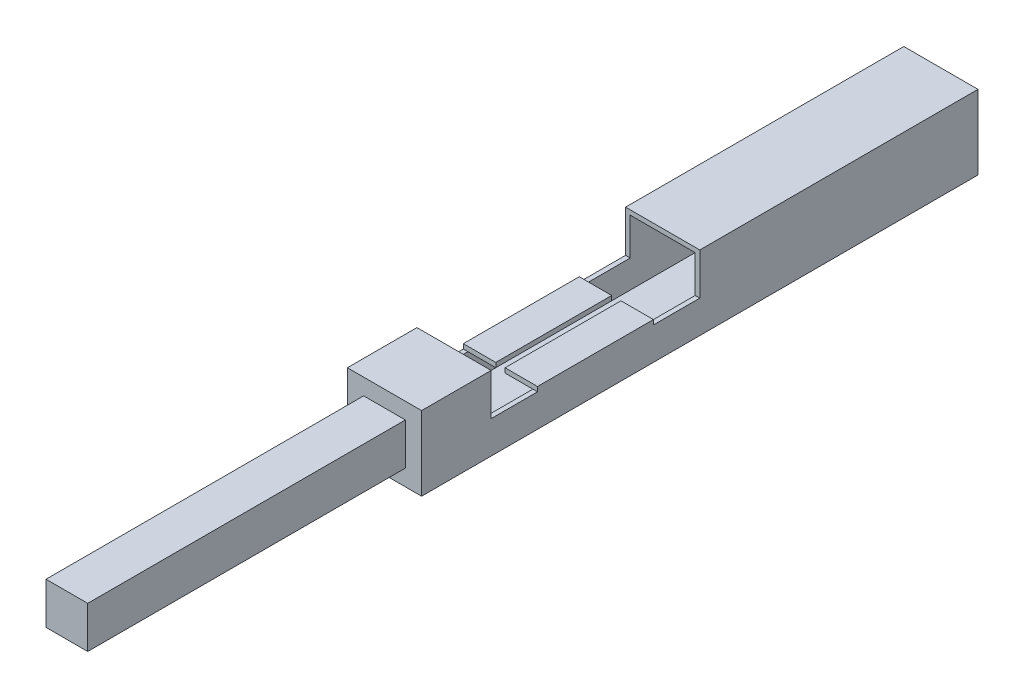
ISO-10303-21;
HEADER;
FILE_DESCRIPTION(('STEP AP214'),'2;1');
FILE_NAME('part.step','',(''),(''),'','','');
FILE_SCHEMA(('AUTOMOTIVE_DESIGN { 1 0 10303 214 1 1 1 1 }'));
ENDSEC;
DATA;
#1=APPLICATION_CONTEXT('core data for automotive mechanical design processes');
#2=APPLICATION_PROTOCOL_DEFINITION('international standard','automotive_design',2000,#1);
#3=PRODUCT_CONTEXT('',#1,'mechanical');
#4=PRODUCT('Part','Part','',(#3));
#5=PRODUCT_RELATED_PRODUCT_CATEGORY('part','',(#4));
#6=PRODUCT_DEFINITION_FORMATION('','',#4);
#7=PRODUCT_DEFINITION_CONTEXT('part definition',#1,'design');
#8=PRODUCT_DEFINITION('design','',#6,#7);
#9=PRODUCT_DEFINITION_SHAPE('','',#8);
#10=(LENGTH_UNIT() NAMED_UNIT(*) SI_UNIT(.MILLI.,.METRE.));
#11=(NAMED_UNIT(*) PLANE_ANGLE_UNIT() SI_UNIT($,.RADIAN.));
#12=(NAMED_UNIT(*) SI_UNIT($,.STERADIAN.) SOLID_ANGLE_UNIT());
#13=UNCERTAINTY_MEASURE_WITH_UNIT(LENGTH_MEASURE(1.E-05),#10,'distance_accuracy_value','');
#14=(GEOMETRIC_REPRESENTATION_CONTEXT(3) GLOBAL_UNCERTAINTY_ASSIGNED_CONTEXT((#13)) GLOBAL_UNIT_ASSIGNED_CONTEXT((#10,
#11,#12)) REPRESENTATION_CONTEXT('',''));
#15=CARTESIAN_POINT('',(0.,0.,0.));
#16=DIRECTION('',(0.,0.,1.));
#17=DIRECTION('',(1.,0.,0.));
#18=AXIS2_PLACEMENT_3D('',#15,#16,#17);
#19=CARTESIAN_POINT('',(-0.45,-0.45,12.85));
#20=DIRECTION('',(0.,1.,0.));
#21=DIRECTION('',(0.,0.,1.));
#22=AXIS2_PLACEMENT_3D('',#19,#20,#21);
#23=PLANE('',#22);
#24=DIRECTION('',(0.,0.,1.));
#25=VECTOR('',#24,1.);
#26=CARTESIAN_POINT('',(0.45,-0.45,12.85));
#27=LINE('',#26,#25);
#28=CARTESIAN_POINT('',(0.45,-0.45,6.));
#29=VERTEX_POINT('',#28);
#30=CARTESIAN_POINT('',(0.45,-0.45,12.85));
#31=VERTEX_POINT('',#30);
#32=EDGE_CURVE('E255',#29,#31,#27,.T.);
#33=ORIENTED_EDGE('',*,*,#32,.T.);
#34=DIRECTION('',(-1.,0.,0.));
#35=VECTOR('',#34,1.);
#36=CARTESIAN_POINT('',(0.,-0.45,12.85));
#37=LINE('',#36,#35);
#38=CARTESIAN_POINT('',(-0.45,-0.45,12.85));
#39=VERTEX_POINT('',#38);
#40=EDGE_CURVE('E263',#31,#39,#37,.T.);
#41=ORIENTED_EDGE('',*,*,#40,.T.);
#42=DIRECTION('',(0.,0.,-1.));
#43=VECTOR('',#42,1.);
#44=CARTESIAN_POINT('',(-0.45,-0.45,12.85));
#45=LINE('',#44,#43);
#46=CARTESIAN_POINT('',(-0.45,-0.45,6.));
#47=VERTEX_POINT('',#46);
#48=EDGE_CURVE('E274',#39,#47,#45,.T.);
#49=ORIENTED_EDGE('',*,*,#48,.T.);
#50=DIRECTION('',(1.,0.,0.));
#51=VECTOR('',#50,1.);
#52=CARTESIAN_POINT('',(-0.45,-0.45,6.));
#53=LINE('',#52,#51);
#54=EDGE_CURVE('E19',#29,#47,#53,.F.);
#55=ORIENTED_EDGE('',*,*,#54,.F.);
#56=EDGE_LOOP('',(#33,#41,#49,#55));
#57=FACE_BOUND('',#56,.T.);
#58=ADVANCED_FACE('F16',(#57),#23,.F.);
#59=CARTESIAN_POINT('',(-0.7,0.,6.));
#60=DIRECTION('',(1.,0.,0.));
#61=DIRECTION('',(0.,0.,-1.));
#62=AXIS2_PLACEMENT_3D('',#59,#60,#61);
#63=PLANE('',#62);
#64=DIRECTION('',(0.,0.,-1.));
#65=VECTOR('',#64,1.);
#66=CARTESIAN_POINT('',(-0.7,-0.0999999999999999,6.));
#67=LINE('',#66,#65);
#68=CARTESIAN_POINT('',(-0.7,-0.0999999999999999,0.));
#69=VERTEX_POINT('',#68);
#70=CARTESIAN_POINT('',(-0.7,-0.0999999999999999,1.));
#71=VERTEX_POINT('',#70);
#72=EDGE_CURVE('E242',#69,#71,#67,.F.);
#73=ORIENTED_EDGE('',*,*,#72,.T.);
#74=DIRECTION('',(0.,0.,1.));
#75=VECTOR('',#74,1.);
#76=CARTESIAN_POINT('',(-0.7,-0.0999999999999999,3.5));
#77=LINE('',#76,#75);
#78=CARTESIAN_POINT('',(-0.7,-0.0999999999999999,3.5));
#79=VERTEX_POINT('',#78);
#80=EDGE_CURVE('E212',#71,#79,#77,.T.);
#81=ORIENTED_EDGE('',*,*,#80,.T.);
#82=DIRECTION('',(0.,0.,-1.));
#83=VECTOR('',#82,1.);
#84=CARTESIAN_POINT('',(-0.7,-0.0999999999999999,6.));
#85=LINE('',#84,#83);
#86=CARTESIAN_POINT('',(-0.7,-0.0999999999999999,4.5));
#87=VERTEX_POINT('',#86);
#88=EDGE_CURVE('E204',#79,#87,#85,.F.);
#89=ORIENTED_EDGE('',*,*,#88,.T.);
#90=DIRECTION('',(0.,1.,0.));
#91=VECTOR('',#90,1.);
#92=CARTESIAN_POINT('',(-0.7,0.,4.5));
#93=LINE('',#92,#91);
#94=CARTESIAN_POINT('',(-0.7,-0.7,4.5));
#95=VERTEX_POINT('',#94);
#96=EDGE_CURVE('E209',#87,#95,#93,.F.);
#97=ORIENTED_EDGE('',*,*,#96,.T.);
#98=DIRECTION('',(0.,0.,1.));
#99=VECTOR('',#98,1.);
#100=CARTESIAN_POINT('',(-0.7,-0.7,6.));
#101=LINE('',#100,#99);
#102=CARTESIAN_POINT('',(-0.7,-0.7,-6.));
#103=VERTEX_POINT('',#102);
#104=EDGE_CURVE('E284',#103,#95,#101,.T.);
#105=ORIENTED_EDGE('',*,*,#104,.F.);
#106=DIRECTION('',(0.,1.,0.));
#107=VECTOR('',#106,1.);
#108=CARTESIAN_POINT('',(-0.7,0.,-6.));
#109=LINE('',#108,#107);
#110=CARTESIAN_POINT('',(-0.7,0.7,-6.));
#111=VERTEX_POINT('',#110);
#112=EDGE_CURVE('E232',#103,#111,#109,.T.);
#113=ORIENTED_EDGE('',*,*,#112,.T.);
#114=DIRECTION('',(0.,0.,-1.));
#115=VECTOR('',#114,1.);
#116=CARTESIAN_POINT('',(-0.7,0.7,6.));
#117=LINE('',#116,#115);
#118=CARTESIAN_POINT('',(-0.7,0.7,0.));
#119=VERTEX_POINT('',#118);
#120=EDGE_CURVE('E299',#119,#111,#117,.T.);
#121=ORIENTED_EDGE('',*,*,#120,.F.);
#122=DIRECTION('',(0.,1.,0.));
#123=VECTOR('',#122,1.);
#124=CARTESIAN_POINT('',(-0.7,0.,0.));
#125=LINE('',#124,#123);
#126=EDGE_CURVE('E199',#119,#69,#125,.F.);
#127=ORIENTED_EDGE('',*,*,#126,.T.);
#128=EDGE_LOOP('',(#73,#81,#89,#97,#105,#113,#121,#127));
#129=FACE_BOUND('',#128,.T.);
#130=ADVANCED_FACE('F206',(#129),#63,.T.);
#131=CARTESIAN_POINT('',(-0.0999999999999999,-0.0999999999999999,3.5));
#132=DIRECTION('',(0.,1.,0.));
#133=DIRECTION('',(0.,0.,1.));
#134=AXIS2_PLACEMENT_3D('',#131,#132,#133);
#135=PLANE('',#134);
#136=DIRECTION('',(1.,0.,0.));
#137=VECTOR('',#136,1.);
#138=CARTESIAN_POINT('',(-0.0999999999999999,-0.0999999999999999,1.));
#139=LINE('',#138,#137);
#140=CARTESIAN_POINT('',(-0.0999999999999999,-0.0999999999999999,1.));
#141=VERTEX_POINT('',#140);
#142=EDGE_CURVE('E249',#141,#71,#139,.F.);
#143=ORIENTED_EDGE('',*,*,#142,.F.);
#144=DIRECTION('',(0.,0.,-1.));
#145=VECTOR('',#144,1.);
#146=CARTESIAN_POINT('',(-0.0999999999999999,-0.0999999999999999,0.));
#147=LINE('',#146,#145);
#148=CARTESIAN_POINT('',(-0.0999999999999999,-0.0999999999999999,3.5));
#149=VERTEX_POINT('',#148);
#150=EDGE_CURVE('E309',#149,#141,#147,.T.);
#151=ORIENTED_EDGE('',*,*,#150,.F.);
#152=DIRECTION('',(1.,0.,0.));
#153=VECTOR('',#152,1.);
#154=CARTESIAN_POINT('',(-0.0999999999999999,-0.0999999999999999,3.5));
#155=LINE('',#154,#153);
#156=EDGE_CURVE('E245',#79,#149,#155,.T.);
#157=ORIENTED_EDGE('',*,*,#156,.F.);
#158=ORIENTED_EDGE('',*,*,#80,.F.);
#159=EDGE_LOOP('',(#143,#151,#157,#158));
#160=FACE_BOUND('',#159,.T.);
#161=ADVANCED_FACE('F645',(#160),#135,.F.);
#162=CARTESIAN_POINT('',(0.45,-0.45,12.85));
#163=DIRECTION('',(-1.,0.,0.));
#164=DIRECTION('',(0.,0.,1.));
#165=AXIS2_PLACEMENT_3D('',#162,#163,#164);
#166=PLANE('',#165);
#167=DIRECTION('',(0.,0.,-1.));
#168=VECTOR('',#167,1.);
#169=CARTESIAN_POINT('',(0.45,0.45,12.85));
#170=LINE('',#169,#168);
#171=CARTESIAN_POINT('',(0.45,0.45,6.));
#172=VERTEX_POINT('',#171);
#173=CARTESIAN_POINT('',(0.45,0.45,12.85));
#174=VERTEX_POINT('',#173);
#175=EDGE_CURVE('E313',#172,#174,#170,.F.);
#176=ORIENTED_EDGE('',*,*,#175,.T.);
#177=DIRECTION('',(0.,1.,0.));
#178=VECTOR('',#177,1.);
#179=CARTESIAN_POINT('',(0.45,0.,12.85));
#180=LINE('',#179,#178);
#181=EDGE_CURVE('E266',#174,#31,#180,.F.);
#182=ORIENTED_EDGE('',*,*,#181,.T.);
#183=ORIENTED_EDGE('',*,*,#32,.F.);
#184=DIRECTION('',(0.,1.,0.));
#185=VECTOR('',#184,1.);
#186=CARTESIAN_POINT('',(0.45,-0.45,6.));
#187=LINE('',#186,#185);
#188=EDGE_CURVE('E259',#172,#29,#187,.F.);
#189=ORIENTED_EDGE('',*,*,#188,.F.);
#190=EDGE_LOOP('',(#176,#182,#183,#189));
#191=FACE_BOUND('',#190,.T.);
#192=ADVANCED_FACE('F641',(#191),#166,.F.);
#193=CARTESIAN_POINT('',(0.,0.,12.85));
#194=DIRECTION('',(0.,0.,-1.));
#195=DIRECTION('',(-1.,0.,0.));
#196=AXIS2_PLACEMENT_3D('',#193,#194,#195);
#197=PLANE('',#196);
#198=DIRECTION('',(1.,0.,0.));
#199=VECTOR('',#198,1.);
#200=CARTESIAN_POINT('',(-0.45,0.45,12.85));
#201=LINE('',#200,#199);
#202=CARTESIAN_POINT('',(-0.45,0.45,12.85));
#203=VERTEX_POINT('',#202);
#204=EDGE_CURVE('E317',#174,#203,#201,.F.);
#205=ORIENTED_EDGE('',*,*,#204,.T.);
#206=DIRECTION('',(0.,1.,0.));
#207=VECTOR('',#206,1.);
#208=CARTESIAN_POINT('',(-0.45,-0.45,12.85));
#209=LINE('',#208,#207);
#210=EDGE_CURVE('E270',#203,#39,#209,.F.);
#211=ORIENTED_EDGE('',*,*,#210,.T.);
#212=ORIENTED_EDGE('',*,*,#40,.F.);
#213=ORIENTED_EDGE('',*,*,#181,.F.);
#214=EDGE_LOOP('',(#205,#211,#212,#213));
#215=FACE_BOUND('',#214,.T.);
#216=ADVANCED_FACE('F637',(#215),#197,.F.);
#217=CARTESIAN_POINT('',(-0.45,-0.45,12.85));
#218=DIRECTION('',(1.,0.,0.));
#219=DIRECTION('',(0.,0.,-1.));
#220=AXIS2_PLACEMENT_3D('',#217,#218,#219);
#221=PLANE('',#220);
#222=ORIENTED_EDGE('',*,*,#48,.F.);
#223=ORIENTED_EDGE('',*,*,#210,.F.);
#224=DIRECTION('',(0.,0.,-1.));
#225=VECTOR('',#224,1.);
#226=CARTESIAN_POINT('',(-0.45,0.45,12.85));
#227=LINE('',#226,#225);
#228=CARTESIAN_POINT('',(-0.45,0.45,6.));
#229=VERTEX_POINT('',#228);
#230=EDGE_CURVE('E321',#203,#229,#227,.T.);
#231=ORIENTED_EDGE('',*,*,#230,.T.);
#232=DIRECTION('',(0.,1.,0.));
#233=VECTOR('',#232,1.);
#234=CARTESIAN_POINT('',(-0.45,-0.45,6.));
#235=LINE('',#234,#233);
#236=EDGE_CURVE('E278',#47,#229,#235,.T.);
#237=ORIENTED_EDGE('',*,*,#236,.F.);
#238=EDGE_LOOP('',(#222,#223,#231,#237));
#239=FACE_BOUND('',#238,.T.);
#240=ADVANCED_FACE('F633',(#239),#221,.F.);
#241=CARTESIAN_POINT('',(0.0999999999999999,0.,0.));
#242=DIRECTION('',(-1.,0.,0.));
#243=DIRECTION('',(0.,0.,1.));
#244=AXIS2_PLACEMENT_3D('',#241,#242,#243);
#245=PLANE('',#244);
#246=DIRECTION('',(0.,1.,0.));
#247=VECTOR('',#246,1.);
#248=CARTESIAN_POINT('',(0.0999999999999999,0.,1.));
#249=LINE('',#248,#247);
#250=CARTESIAN_POINT('',(0.0999999999999999,0.,1.));
#251=VERTEX_POINT('',#250);
#252=CARTESIAN_POINT('',(0.0999999999999999,-0.0999999999999999,1.));
#253=VERTEX_POINT('',#252);
#254=EDGE_CURVE('E281',#251,#253,#249,.F.);
#255=ORIENTED_EDGE('',*,*,#254,.T.);
#256=DIRECTION('',(0.,0.,-1.));
#257=VECTOR('',#256,1.);
#258=CARTESIAN_POINT('',(0.0999999999999999,-0.0999999999999999,3.5));
#259=LINE('',#258,#257);
#260=CARTESIAN_POINT('',(0.0999999999999999,-0.0999999999999999,3.5));
#261=VERTEX_POINT('',#260);
#262=EDGE_CURVE('E292',#261,#253,#259,.T.);
#263=ORIENTED_EDGE('',*,*,#262,.F.);
#264=DIRECTION('',(0.,1.,0.));
#265=VECTOR('',#264,1.);
#266=CARTESIAN_POINT('',(0.0999999999999999,-0.0999999999999999,3.5));
#267=LINE('',#266,#265);
#268=CARTESIAN_POINT('',(0.0999999999999999,0.,3.5));
#269=VERTEX_POINT('',#268);
#270=EDGE_CURVE('E325',#269,#261,#267,.F.);
#271=ORIENTED_EDGE('',*,*,#270,.F.);
#272=DIRECTION('',(0.,0.,1.));
#273=VECTOR('',#272,1.);
#274=CARTESIAN_POINT('',(0.0999999999999999,0.,3.5));
#275=LINE('',#274,#273);
#276=EDGE_CURVE('E334',#251,#269,#275,.T.);
#277=ORIENTED_EDGE('',*,*,#276,.F.);
#278=EDGE_LOOP('',(#255,#263,#271,#277));
#279=FACE_BOUND('',#278,.T.);
#280=ADVANCED_FACE('F629',(#279),#245,.T.);
#281=CARTESIAN_POINT('',(0.,-0.7,6.));
#282=DIRECTION('',(0.,1.,0.));
#283=DIRECTION('',(0.,0.,1.));
#284=AXIS2_PLACEMENT_3D('',#281,#282,#283);
#285=PLANE('',#284);
#286=DIRECTION('',(0.,0.,1.));
#287=VECTOR('',#286,1.);
#288=CARTESIAN_POINT('',(0.7,-0.7,6.));
#289=LINE('',#288,#287);
#290=CARTESIAN_POINT('',(0.7,-0.7,-6.));
#291=VERTEX_POINT('',#290);
#292=CARTESIAN_POINT('',(0.7,-0.7,4.5));
#293=VERTEX_POINT('',#292);
#294=EDGE_CURVE('E351',#291,#293,#289,.T.);
#295=ORIENTED_EDGE('',*,*,#294,.F.);
#296=DIRECTION('',(1.,0.,0.));
#297=VECTOR('',#296,1.);
#298=CARTESIAN_POINT('',(0.,-0.7,-6.));
#299=LINE('',#298,#297);
#300=EDGE_CURVE('E288',#291,#103,#299,.F.);
#301=ORIENTED_EDGE('',*,*,#300,.T.);
#302=ORIENTED_EDGE('',*,*,#104,.T.);
#303=DIRECTION('',(1.,0.,0.));
#304=VECTOR('',#303,1.);
#305=CARTESIAN_POINT('',(0.,-0.7,4.5));
#306=LINE('',#305,#304);
#307=EDGE_CURVE('E230',#95,#293,#306,.T.);
#308=ORIENTED_EDGE('',*,*,#307,.T.);
#309=EDGE_LOOP('',(#295,#301,#302,#308));
#310=FACE_BOUND('',#309,.T.);
#311=ADVANCED_FACE('F625',(#310),#285,.T.);
#312=CARTESIAN_POINT('',(0.0999999999999999,-0.0999999999999999,3.5));
#313=DIRECTION('',(0.,-1.,0.));
#314=DIRECTION('',(0.,0.,-1.));
#315=AXIS2_PLACEMENT_3D('',#312,#313,#314);
#316=PLANE('',#315);
#317=DIRECTION('',(1.,0.,0.));
#318=VECTOR('',#317,1.);
#319=CARTESIAN_POINT('',(0.0999999999999999,-0.0999999999999999,3.5));
#320=LINE('',#319,#318);
#321=CARTESIAN_POINT('',(0.7,-0.0999999999999999,3.5));
#322=VERTEX_POINT('',#321);
#323=EDGE_CURVE('E328',#261,#322,#320,.T.);
#324=ORIENTED_EDGE('',*,*,#323,.F.);
#325=ORIENTED_EDGE('',*,*,#262,.T.);
#326=DIRECTION('',(-1.,0.,0.));
#327=VECTOR('',#326,1.);
#328=CARTESIAN_POINT('',(0.0999999999999999,-0.0999999999999999,1.));
#329=LINE('',#328,#327);
#330=CARTESIAN_POINT('',(0.7,-0.0999999999999999,1.));
#331=VERTEX_POINT('',#330);
#332=EDGE_CURVE('E340',#331,#253,#329,.T.);
#333=ORIENTED_EDGE('',*,*,#332,.F.);
#334=DIRECTION('',(0.,0.,1.));
#335=VECTOR('',#334,1.);
#336=CARTESIAN_POINT('',(0.7,-0.0999999999999999,6.));
#337=LINE('',#336,#335);
#338=EDGE_CURVE('E359',#322,#331,#337,.F.);
#339=ORIENTED_EDGE('',*,*,#338,.F.);
#340=EDGE_LOOP('',(#324,#325,#333,#339));
#341=FACE_BOUND('',#340,.T.);
#342=ADVANCED_FACE('F621',(#341),#316,.T.);
#343=CARTESIAN_POINT('',(0.,0.7,6.));
#344=DIRECTION('',(0.,-1.,0.));
#345=DIRECTION('',(0.,0.,-1.));
#346=AXIS2_PLACEMENT_3D('',#343,#344,#345);
#347=PLANE('',#346);
#348=DIRECTION('',(1.,0.,0.));
#349=VECTOR('',#348,1.);
#350=CARTESIAN_POINT('',(0.,0.7,-6.));
#351=LINE('',#350,#349);
#352=CARTESIAN_POINT('',(0.7,0.7,-6.));
#353=VERTEX_POINT('',#352);
#354=EDGE_CURVE('E303',#111,#353,#351,.T.);
#355=ORIENTED_EDGE('',*,*,#354,.T.);
#356=DIRECTION('',(0.,0.,1.));
#357=VECTOR('',#356,1.);
#358=CARTESIAN_POINT('',(0.7,0.7,6.));
#359=LINE('',#358,#357);
#360=CARTESIAN_POINT('',(0.7,0.7,0.));
#361=VERTEX_POINT('',#360);
#362=EDGE_CURVE('E366',#361,#353,#359,.F.);
#363=ORIENTED_EDGE('',*,*,#362,.F.);
#364=DIRECTION('',(1.,0.,0.));
#365=VECTOR('',#364,1.);
#366=CARTESIAN_POINT('',(0.,0.7,0.));
#367=LINE('',#366,#365);
#368=EDGE_CURVE('E296',#361,#119,#367,.F.);
#369=ORIENTED_EDGE('',*,*,#368,.T.);
#370=ORIENTED_EDGE('',*,*,#120,.T.);
#371=EDGE_LOOP('',(#355,#363,#369,#370));
#372=FACE_BOUND('',#371,.T.);
#373=ADVANCED_FACE('F617',(#372),#347,.T.);
#374=CARTESIAN_POINT('',(-0.0999999999999999,0.,0.));
#375=DIRECTION('',(1.,0.,0.));
#376=DIRECTION('',(0.,0.,-1.));
#377=AXIS2_PLACEMENT_3D('',#374,#375,#376);
#378=PLANE('',#377);
#379=DIRECTION('',(0.,1.,0.));
#380=VECTOR('',#379,1.);
#381=CARTESIAN_POINT('',(-0.0999999999999999,-0.0999999999999999,1.));
#382=LINE('',#381,#380);
#383=CARTESIAN_POINT('',(-0.0999999999999999,0.,1.));
#384=VERTEX_POINT('',#383);
#385=EDGE_CURVE('E388',#141,#384,#382,.T.);
#386=ORIENTED_EDGE('',*,*,#385,.T.);
#387=DIRECTION('',(0.,0.,-1.));
#388=VECTOR('',#387,1.);
#389=CARTESIAN_POINT('',(-0.0999999999999999,0.,3.5));
#390=LINE('',#389,#388);
#391=CARTESIAN_POINT('',(-0.0999999999999999,0.,3.5));
#392=VERTEX_POINT('',#391);
#393=EDGE_CURVE('E395',#384,#392,#390,.F.);
#394=ORIENTED_EDGE('',*,*,#393,.T.);
#395=DIRECTION('',(0.,1.,0.));
#396=VECTOR('',#395,1.);
#397=CARTESIAN_POINT('',(-0.0999999999999999,0.,3.5));
#398=LINE('',#397,#396);
#399=EDGE_CURVE('E306',#392,#149,#398,.F.);
#400=ORIENTED_EDGE('',*,*,#399,.T.);
#401=ORIENTED_EDGE('',*,*,#150,.T.);
#402=EDGE_LOOP('',(#386,#394,#400,#401));
#403=FACE_BOUND('',#402,.T.);
#404=ADVANCED_FACE('F613',(#403),#378,.T.);
#405=CARTESIAN_POINT('',(-0.45,0.45,12.85));
#406=DIRECTION('',(0.,-1.,0.));
#407=DIRECTION('',(0.,0.,-1.));
#408=AXIS2_PLACEMENT_3D('',#405,#406,#407);
#409=PLANE('',#408);
#410=ORIENTED_EDGE('',*,*,#230,.F.);
#411=ORIENTED_EDGE('',*,*,#204,.F.);
#412=ORIENTED_EDGE('',*,*,#175,.F.);
#413=DIRECTION('',(1.,0.,0.));
#414=VECTOR('',#413,1.);
#415=CARTESIAN_POINT('',(0.,0.45,6.));
#416=LINE('',#415,#414);
#417=EDGE_CURVE('E416',#229,#172,#416,.T.);
#418=ORIENTED_EDGE('',*,*,#417,.F.);
#419=EDGE_LOOP('',(#410,#411,#412,#418));
#420=FACE_BOUND('',#419,.T.);
#421=ADVANCED_FACE('F609',(#420),#409,.F.);
#422=CARTESIAN_POINT('',(-0.8,-0.0999999999999999,4.5));
#423=DIRECTION('',(0.,-1.,0.));
#424=DIRECTION('',(0.,0.,-1.));
#425=AXIS2_PLACEMENT_3D('',#422,#423,#424);
#426=PLANE('',#425);
#427=DIRECTION('',(1.,0.,0.));
#428=VECTOR('',#427,1.);
#429=CARTESIAN_POINT('',(0.0999999999999999,-0.0999999999999999,3.5));
#430=LINE('',#429,#428);
#431=CARTESIAN_POINT('',(0.8,-0.0999999999999999,3.5));
#432=VERTEX_POINT('',#431);
#433=EDGE_CURVE('E331',#322,#432,#430,.T.);
#434=ORIENTED_EDGE('',*,*,#433,.F.);
#435=DIRECTION('',(0.,0.,1.));
#436=VECTOR('',#435,1.);
#437=CARTESIAN_POINT('',(0.7,-0.0999999999999999,6.));
#438=LINE('',#437,#436);
#439=CARTESIAN_POINT('',(0.7,-0.0999999999999999,4.5));
#440=VERTEX_POINT('',#439);
#441=EDGE_CURVE('E355',#440,#322,#438,.F.);
#442=ORIENTED_EDGE('',*,*,#441,.F.);
#443=DIRECTION('',(1.,0.,0.));
#444=VECTOR('',#443,1.);
#445=CARTESIAN_POINT('',(-0.8,-0.0999999999999999,4.5));
#446=LINE('',#445,#444);
#447=CARTESIAN_POINT('',(0.8,-0.0999999999999999,4.5));
#448=VERTEX_POINT('',#447);
#449=EDGE_CURVE('E413',#440,#448,#446,.T.);
#450=ORIENTED_EDGE('',*,*,#449,.T.);
#451=DIRECTION('',(0.,0.,1.));
#452=VECTOR('',#451,1.);
#453=CARTESIAN_POINT('',(0.8,-0.0999999999999999,6.));
#454=LINE('',#453,#452);
#455=EDGE_CURVE('E435',#448,#432,#454,.F.);
#456=ORIENTED_EDGE('',*,*,#455,.T.);
#457=EDGE_LOOP('',(#434,#442,#450,#456));
#458=FACE_BOUND('',#457,.T.);
#459=ADVANCED_FACE('F605',(#458),#426,.F.);
#460=CARTESIAN_POINT('',(0.0999999999999999,-0.0999999999999999,3.5));
#461=DIRECTION('',(0.,0.,1.));
#462=DIRECTION('',(1.,0.,0.));
#463=AXIS2_PLACEMENT_3D('',#460,#461,#462);
#464=PLANE('',#463);
#465=ORIENTED_EDGE('',*,*,#323,.T.);
#466=ORIENTED_EDGE('',*,*,#433,.T.);
#467=DIRECTION('',(0.,1.,0.));
#468=VECTOR('',#467,1.);
#469=CARTESIAN_POINT('',(0.8,-0.8,3.5));
#470=LINE('',#469,#468);
#471=CARTESIAN_POINT('',(0.8,0.,3.5));
#472=VERTEX_POINT('',#471);
#473=EDGE_CURVE('E439',#432,#472,#470,.T.);
#474=ORIENTED_EDGE('',*,*,#473,.T.);
#475=DIRECTION('',(1.,0.,0.));
#476=VECTOR('',#475,1.);
#477=CARTESIAN_POINT('',(0.0999999999999999,0.,3.5));
#478=LINE('',#477,#476);
#479=EDGE_CURVE('E337',#269,#472,#478,.T.);
#480=ORIENTED_EDGE('',*,*,#479,.F.);
#481=ORIENTED_EDGE('',*,*,#270,.T.);
#482=EDGE_LOOP('',(#465,#466,#474,#480,#481));
#483=FACE_BOUND('',#482,.T.);
#484=ADVANCED_FACE('F601',(#483),#464,.T.);
#485=CARTESIAN_POINT('',(0.0999999999999999,0.,3.5));
#486=DIRECTION('',(0.,1.,0.));
#487=DIRECTION('',(0.,0.,1.));
#488=AXIS2_PLACEMENT_3D('',#485,#486,#487);
#489=PLANE('',#488);
#490=ORIENTED_EDGE('',*,*,#276,.T.);
#491=ORIENTED_EDGE('',*,*,#479,.T.);
#492=DIRECTION('',(0.,0.,1.));
#493=VECTOR('',#492,1.);
#494=CARTESIAN_POINT('',(0.8,0.,6.));
#495=LINE('',#494,#493);
#496=CARTESIAN_POINT('',(0.8,0.,1.));
#497=VERTEX_POINT('',#496);
#498=EDGE_CURVE('E443',#472,#497,#495,.F.);
#499=ORIENTED_EDGE('',*,*,#498,.T.);
#500=DIRECTION('',(-1.,0.,0.));
#501=VECTOR('',#500,1.);
#502=CARTESIAN_POINT('',(0.0999999999999999,0.,1.));
#503=LINE('',#502,#501);
#504=EDGE_CURVE('E344',#251,#497,#503,.F.);
#505=ORIENTED_EDGE('',*,*,#504,.F.);
#506=EDGE_LOOP('',(#490,#491,#499,#505));
#507=FACE_BOUND('',#506,.T.);
#508=ADVANCED_FACE('F597',(#507),#489,.T.);
#509=CARTESIAN_POINT('',(0.0999999999999999,-0.0999999999999999,1.));
#510=DIRECTION('',(0.,0.,-1.));
#511=DIRECTION('',(-1.,0.,0.));
#512=AXIS2_PLACEMENT_3D('',#509,#510,#511);
#513=PLANE('',#512);
#514=ORIENTED_EDGE('',*,*,#254,.F.);
#515=ORIENTED_EDGE('',*,*,#504,.T.);
#516=DIRECTION('',(0.,1.,0.));
#517=VECTOR('',#516,1.);
#518=CARTESIAN_POINT('',(0.8,-0.8,1.));
#519=LINE('',#518,#517);
#520=CARTESIAN_POINT('',(0.8,-0.0999999999999999,1.));
#521=VERTEX_POINT('',#520);
#522=EDGE_CURVE('E447',#497,#521,#519,.F.);
#523=ORIENTED_EDGE('',*,*,#522,.T.);
#524=DIRECTION('',(1.,0.,0.));
#525=VECTOR('',#524,1.);
#526=CARTESIAN_POINT('',(-0.8,-0.0999999999999999,1.));
#527=LINE('',#526,#525);
#528=EDGE_CURVE('E347',#521,#331,#527,.F.);
#529=ORIENTED_EDGE('',*,*,#528,.T.);
#530=ORIENTED_EDGE('',*,*,#332,.T.);
#531=EDGE_LOOP('',(#514,#515,#523,#529,#530));
#532=FACE_BOUND('',#531,.T.);
#533=ADVANCED_FACE('F593',(#532),#513,.T.);
#534=CARTESIAN_POINT('',(-0.8,-0.0999999999999999,4.5));
#535=DIRECTION('',(0.,-1.,0.));
#536=DIRECTION('',(0.,0.,-1.));
#537=AXIS2_PLACEMENT_3D('',#534,#535,#536);
#538=PLANE('',#537);
#539=ORIENTED_EDGE('',*,*,#528,.F.);
#540=DIRECTION('',(0.,0.,1.));
#541=VECTOR('',#540,1.);
#542=CARTESIAN_POINT('',(0.8,-0.0999999999999999,6.));
#543=LINE('',#542,#541);
#544=CARTESIAN_POINT('',(0.8,-0.0999999999999999,0.));
#545=VERTEX_POINT('',#544);
#546=EDGE_CURVE('E451',#521,#545,#543,.F.);
#547=ORIENTED_EDGE('',*,*,#546,.T.);
#548=DIRECTION('',(-1.,0.,0.));
#549=VECTOR('',#548,1.);
#550=CARTESIAN_POINT('',(-0.8,-0.0999999999999999,0.));
#551=LINE('',#550,#549);
#552=CARTESIAN_POINT('',(0.7,-0.0999999999999999,0.));
#553=VERTEX_POINT('',#552);
#554=EDGE_CURVE('E373',#545,#553,#551,.T.);
#555=ORIENTED_EDGE('',*,*,#554,.T.);
#556=DIRECTION('',(0.,0.,1.));
#557=VECTOR('',#556,1.);
#558=CARTESIAN_POINT('',(0.7,-0.0999999999999999,6.));
#559=LINE('',#558,#557);
#560=EDGE_CURVE('E363',#331,#553,#559,.F.);
#561=ORIENTED_EDGE('',*,*,#560,.F.);
#562=EDGE_LOOP('',(#539,#547,#555,#561));
#563=FACE_BOUND('',#562,.T.);
#564=ADVANCED_FACE('F589',(#563),#538,.F.);
#565=CARTESIAN_POINT('',(0.7,0.,6.));
#566=DIRECTION('',(-1.,0.,0.));
#567=DIRECTION('',(0.,0.,1.));
#568=AXIS2_PLACEMENT_3D('',#565,#566,#567);
#569=PLANE('',#568);
#570=ORIENTED_EDGE('',*,*,#362,.T.);
#571=DIRECTION('',(0.,1.,0.));
#572=VECTOR('',#571,1.);
#573=CARTESIAN_POINT('',(0.7,0.,-6.));
#574=LINE('',#573,#572);
#575=EDGE_CURVE('E470',#353,#291,#574,.F.);
#576=ORIENTED_EDGE('',*,*,#575,.T.);
#577=ORIENTED_EDGE('',*,*,#294,.T.);
#578=DIRECTION('',(0.,1.,0.));
#579=VECTOR('',#578,1.);
#580=CARTESIAN_POINT('',(0.7,0.8,4.5));
#581=LINE('',#580,#579);
#582=EDGE_CURVE('E224',#293,#440,#581,.T.);
#583=ORIENTED_EDGE('',*,*,#582,.T.);
#584=ORIENTED_EDGE('',*,*,#441,.T.);
#585=ORIENTED_EDGE('',*,*,#338,.T.);
#586=ORIENTED_EDGE('',*,*,#560,.T.);
#587=DIRECTION('',(0.,1.,0.));
#588=VECTOR('',#587,1.);
#589=CARTESIAN_POINT('',(0.7,0.8,0.));
#590=LINE('',#589,#588);
#591=EDGE_CURVE('E377',#553,#361,#590,.T.);
#592=ORIENTED_EDGE('',*,*,#591,.T.);
#593=EDGE_LOOP('',(#570,#576,#577,#583,#584,#585,#586,#592));
#594=FACE_BOUND('',#593,.T.);
#595=ADVANCED_FACE('F585',(#594),#569,.T.);
#596=CARTESIAN_POINT('',(-0.8,0.8,6.));
#597=DIRECTION('',(0.,-1.,0.));
#598=DIRECTION('',(0.,0.,-1.));
#599=AXIS2_PLACEMENT_3D('',#596,#597,#598);
#600=PLANE('',#599);
#601=DIRECTION('',(1.,0.,0.));
#602=VECTOR('',#601,1.);
#603=CARTESIAN_POINT('',(-0.8,0.8,4.5));
#604=LINE('',#603,#602);
#605=CARTESIAN_POINT('',(0.8,0.8,4.5));
#606=VERTEX_POINT('',#605);
#607=CARTESIAN_POINT('',(-0.8,0.8,4.5));
#608=VERTEX_POINT('',#607);
#609=EDGE_CURVE('E225',#606,#608,#604,.F.);
#610=ORIENTED_EDGE('',*,*,#609,.T.);
#611=DIRECTION('',(0.,0.,-1.));
#612=VECTOR('',#611,1.);
#613=CARTESIAN_POINT('',(-0.8,0.8,6.));
#614=LINE('',#613,#612);
#615=CARTESIAN_POINT('',(-0.8,0.8,6.));
#616=VERTEX_POINT('',#615);
#617=EDGE_CURVE('E474',#608,#616,#614,.F.);
#618=ORIENTED_EDGE('',*,*,#617,.T.);
#619=DIRECTION('',(1.,0.,0.));
#620=VECTOR('',#619,1.);
#621=CARTESIAN_POINT('',(0.,0.8,6.));
#622=LINE('',#621,#620);
#623=CARTESIAN_POINT('',(0.8,0.8,6.));
#624=VERTEX_POINT('',#623);
#625=EDGE_CURVE('E420',#624,#616,#622,.F.);
#626=ORIENTED_EDGE('',*,*,#625,.F.);
#627=DIRECTION('',(0.,0.,1.));
#628=VECTOR('',#627,1.);
#629=CARTESIAN_POINT('',(0.8,0.8,6.));
#630=LINE('',#629,#628);
#631=EDGE_CURVE('E427',#624,#606,#630,.F.);
#632=ORIENTED_EDGE('',*,*,#631,.T.);
#633=EDGE_LOOP('',(#610,#618,#626,#632));
#634=FACE_BOUND('',#633,.T.);
#635=ADVANCED_FACE('F581',(#634),#600,.F.);
#636=CARTESIAN_POINT('',(-0.8,0.8,6.));
#637=DIRECTION('',(0.,-1.,0.));
#638=DIRECTION('',(0.,0.,-1.));
#639=AXIS2_PLACEMENT_3D('',#636,#637,#638);
#640=PLANE('',#639);
#641=DIRECTION('',(-1.,0.,0.));
#642=VECTOR('',#641,1.);
#643=CARTESIAN_POINT('',(-0.8,0.8,0.));
#644=LINE('',#643,#642);
#645=CARTESIAN_POINT('',(-0.8,0.8,0.));
#646=VERTEX_POINT('',#645);
#647=CARTESIAN_POINT('',(0.8,0.8,0.));
#648=VERTEX_POINT('',#647);
#649=EDGE_CURVE('E370',#646,#648,#644,.F.);
#650=ORIENTED_EDGE('',*,*,#649,.T.);
#651=DIRECTION('',(0.,0.,1.));
#652=VECTOR('',#651,1.);
#653=CARTESIAN_POINT('',(0.8,0.8,6.));
#654=LINE('',#653,#652);
#655=CARTESIAN_POINT('',(0.8,0.8,-6.));
#656=VERTEX_POINT('',#655);
#657=EDGE_CURVE('E459',#648,#656,#654,.F.);
#658=ORIENTED_EDGE('',*,*,#657,.T.);
#659=DIRECTION('',(1.,0.,0.));
#660=VECTOR('',#659,1.);
#661=CARTESIAN_POINT('',(0.,0.8,-6.));
#662=LINE('',#661,#660);
#663=CARTESIAN_POINT('',(-0.8,0.8,-6.));
#664=VERTEX_POINT('',#663);
#665=EDGE_CURVE('E463',#656,#664,#662,.F.);
#666=ORIENTED_EDGE('',*,*,#665,.T.);
#667=DIRECTION('',(0.,0.,-1.));
#668=VECTOR('',#667,1.);
#669=CARTESIAN_POINT('',(-0.8,0.8,6.));
#670=LINE('',#669,#668);
#671=EDGE_CURVE('E484',#664,#646,#670,.F.);
#672=ORIENTED_EDGE('',*,*,#671,.T.);
#673=EDGE_LOOP('',(#650,#658,#666,#672));
#674=FACE_BOUND('',#673,.T.);
#675=ADVANCED_FACE('F577',(#674),#640,.F.);
#676=CARTESIAN_POINT('',(-0.8,0.8,0.));
#677=DIRECTION('',(0.,0.,-1.));
#678=DIRECTION('',(-1.,0.,0.));
#679=AXIS2_PLACEMENT_3D('',#676,#677,#678);
#680=PLANE('',#679);
#681=ORIENTED_EDGE('',*,*,#554,.F.);
#682=DIRECTION('',(0.,1.,0.));
#683=VECTOR('',#682,1.);
#684=CARTESIAN_POINT('',(0.8,-0.8,0.));
#685=LINE('',#684,#683);
#686=EDGE_CURVE('E455',#545,#648,#685,.T.);
#687=ORIENTED_EDGE('',*,*,#686,.T.);
#688=ORIENTED_EDGE('',*,*,#649,.F.);
#689=DIRECTION('',(0.,1.,0.));
#690=VECTOR('',#689,1.);
#691=CARTESIAN_POINT('',(-0.8,-0.8,0.));
#692=LINE('',#691,#690);
#693=CARTESIAN_POINT('',(-0.8,-0.0999999999999999,0.));
#694=VERTEX_POINT('',#693);
#695=EDGE_CURVE('E488',#646,#694,#692,.F.);
#696=ORIENTED_EDGE('',*,*,#695,.T.);
#697=DIRECTION('',(1.,0.,0.));
#698=VECTOR('',#697,1.);
#699=CARTESIAN_POINT('',(-0.8,-0.0999999999999999,0.));
#700=LINE('',#699,#698);
#701=EDGE_CURVE('E381',#694,#69,#700,.T.);
#702=ORIENTED_EDGE('',*,*,#701,.T.);
#703=ORIENTED_EDGE('',*,*,#126,.F.);
#704=ORIENTED_EDGE('',*,*,#368,.F.);
#705=ORIENTED_EDGE('',*,*,#591,.F.);
#706=EDGE_LOOP('',(#681,#687,#688,#696,#702,#703,#704,#705));
#707=FACE_BOUND('',#706,.T.);
#708=ADVANCED_FACE('F573',(#707),#680,.F.);
#709=CARTESIAN_POINT('',(-0.8,-0.0999999999999999,4.5));
#710=DIRECTION('',(0.,-1.,0.));
#711=DIRECTION('',(0.,0.,-1.));
#712=AXIS2_PLACEMENT_3D('',#709,#710,#711);
#713=PLANE('',#712);
#714=ORIENTED_EDGE('',*,*,#72,.F.);
#715=ORIENTED_EDGE('',*,*,#701,.F.);
#716=DIRECTION('',(0.,0.,-1.));
#717=VECTOR('',#716,1.);
#718=CARTESIAN_POINT('',(-0.8,-0.0999999999999999,6.));
#719=LINE('',#718,#717);
#720=CARTESIAN_POINT('',(-0.8,-0.0999999999999999,1.));
#721=VERTEX_POINT('',#720);
#722=EDGE_CURVE('E492',#694,#721,#719,.F.);
#723=ORIENTED_EDGE('',*,*,#722,.T.);
#724=DIRECTION('',(1.,0.,0.));
#725=VECTOR('',#724,1.);
#726=CARTESIAN_POINT('',(-0.0999999999999999,-0.0999999999999999,1.));
#727=LINE('',#726,#725);
#728=EDGE_CURVE('E384',#721,#71,#727,.T.);
#729=ORIENTED_EDGE('',*,*,#728,.T.);
#730=EDGE_LOOP('',(#714,#715,#723,#729));
#731=FACE_BOUND('',#730,.T.);
#732=ADVANCED_FACE('F569',(#731),#713,.F.);
#733=CARTESIAN_POINT('',(-0.0999999999999999,-0.0999999999999999,1.));
#734=DIRECTION('',(0.,0.,1.));
#735=DIRECTION('',(1.,0.,0.));
#736=AXIS2_PLACEMENT_3D('',#733,#734,#735);
#737=PLANE('',#736);
#738=DIRECTION('',(1.,0.,0.));
#739=VECTOR('',#738,1.);
#740=CARTESIAN_POINT('',(-0.0999999999999999,0.,1.));
#741=LINE('',#740,#739);
#742=CARTESIAN_POINT('',(-0.8,0.,1.));
#743=VERTEX_POINT('',#742);
#744=EDGE_CURVE('E391',#743,#384,#741,.T.);
#745=ORIENTED_EDGE('',*,*,#744,.T.);
#746=ORIENTED_EDGE('',*,*,#385,.F.);
#747=ORIENTED_EDGE('',*,*,#142,.T.);
#748=ORIENTED_EDGE('',*,*,#728,.F.);
#749=DIRECTION('',(0.,1.,0.));
#750=VECTOR('',#749,1.);
#751=CARTESIAN_POINT('',(-0.8,-0.8,1.));
#752=LINE('',#751,#750);
#753=EDGE_CURVE('E495',#721,#743,#752,.T.);
#754=ORIENTED_EDGE('',*,*,#753,.T.);
#755=EDGE_LOOP('',(#745,#746,#747,#748,#754));
#756=FACE_BOUND('',#755,.T.);
#757=ADVANCED_FACE('F565',(#756),#737,.F.);
#758=CARTESIAN_POINT('',(-0.0999999999999999,0.,3.5));
#759=DIRECTION('',(0.,-1.,0.));
#760=DIRECTION('',(0.,0.,-1.));
#761=AXIS2_PLACEMENT_3D('',#758,#759,#760);
#762=PLANE('',#761);
#763=DIRECTION('',(-1.,0.,0.));
#764=VECTOR('',#763,1.);
#765=CARTESIAN_POINT('',(-0.0999999999999999,0.,3.5));
#766=LINE('',#765,#764);
#767=CARTESIAN_POINT('',(-0.8,0.,3.5));
#768=VERTEX_POINT('',#767);
#769=EDGE_CURVE('E399',#768,#392,#766,.F.);
#770=ORIENTED_EDGE('',*,*,#769,.T.);
#771=ORIENTED_EDGE('',*,*,#393,.F.);
#772=ORIENTED_EDGE('',*,*,#744,.F.);
#773=DIRECTION('',(0.,0.,-1.));
#774=VECTOR('',#773,1.);
#775=CARTESIAN_POINT('',(-0.8,0.,6.));
#776=LINE('',#775,#774);
#777=EDGE_CURVE('E499',#743,#768,#776,.F.);
#778=ORIENTED_EDGE('',*,*,#777,.T.);
#779=EDGE_LOOP('',(#770,#771,#772,#778));
#780=FACE_BOUND('',#779,.T.);
#781=ADVANCED_FACE('F561',(#780),#762,.F.);
#782=CARTESIAN_POINT('',(-0.0999999999999999,-0.0999999999999999,3.5));
#783=DIRECTION('',(0.,0.,-1.));
#784=DIRECTION('',(-1.,0.,0.));
#785=AXIS2_PLACEMENT_3D('',#782,#783,#784);
#786=PLANE('',#785);
#787=DIRECTION('',(1.,0.,0.));
#788=VECTOR('',#787,1.);
#789=CARTESIAN_POINT('',(-0.8,-0.0999999999999999,3.5));
#790=LINE('',#789,#788);
#791=CARTESIAN_POINT('',(-0.8,-0.0999999999999999,3.5));
#792=VERTEX_POINT('',#791);
#793=EDGE_CURVE('E403',#792,#79,#790,.T.);
#794=ORIENTED_EDGE('',*,*,#793,.T.);
#795=ORIENTED_EDGE('',*,*,#156,.T.);
#796=ORIENTED_EDGE('',*,*,#399,.F.);
#797=ORIENTED_EDGE('',*,*,#769,.F.);
#798=DIRECTION('',(0.,1.,0.));
#799=VECTOR('',#798,1.);
#800=CARTESIAN_POINT('',(-0.8,-0.8,3.5));
#801=LINE('',#800,#799);
#802=EDGE_CURVE('E503',#768,#792,#801,.F.);
#803=ORIENTED_EDGE('',*,*,#802,.T.);
#804=EDGE_LOOP('',(#794,#795,#796,#797,#803));
#805=FACE_BOUND('',#804,.T.);
#806=ADVANCED_FACE('F558',(#805),#786,.F.);
#807=CARTESIAN_POINT('',(-0.8,-0.0999999999999999,4.5));
#808=DIRECTION('',(0.,-1.,0.));
#809=DIRECTION('',(0.,0.,-1.));
#810=AXIS2_PLACEMENT_3D('',#807,#808,#809);
#811=PLANE('',#810);
#812=DIRECTION('',(0.,0.,-1.));
#813=VECTOR('',#812,1.);
#814=CARTESIAN_POINT('',(-0.8,-0.0999999999999999,6.));
#815=LINE('',#814,#813);
#816=CARTESIAN_POINT('',(-0.8,-0.0999999999999999,4.5));
#817=VERTEX_POINT('',#816);
#818=EDGE_CURVE('E219',#792,#817,#815,.F.);
#819=ORIENTED_EDGE('',*,*,#818,.T.);
#820=DIRECTION('',(1.,0.,0.));
#821=VECTOR('',#820,1.);
#822=CARTESIAN_POINT('',(-0.8,-0.0999999999999999,4.5));
#823=LINE('',#822,#821);
#824=EDGE_CURVE('E216',#817,#87,#823,.T.);
#825=ORIENTED_EDGE('',*,*,#824,.T.);
#826=ORIENTED_EDGE('',*,*,#88,.F.);
#827=ORIENTED_EDGE('',*,*,#793,.F.);
#828=EDGE_LOOP('',(#819,#825,#826,#827));
#829=FACE_BOUND('',#828,.T.);
#830=ADVANCED_FACE('F217',(#829),#811,.F.);
#831=CARTESIAN_POINT('',(-0.8,0.8,4.5));
#832=DIRECTION('',(0.,0.,1.));
#833=DIRECTION('',(1.,0.,0.));
#834=AXIS2_PLACEMENT_3D('',#831,#832,#833);
#835=PLANE('',#834);
#836=ORIENTED_EDGE('',*,*,#582,.F.);
#837=ORIENTED_EDGE('',*,*,#307,.F.);
#838=ORIENTED_EDGE('',*,*,#96,.F.);
#839=ORIENTED_EDGE('',*,*,#824,.F.);
#840=DIRECTION('',(0.,1.,0.));
#841=VECTOR('',#840,1.);
#842=CARTESIAN_POINT('',(-0.8,-0.8,4.5));
#843=LINE('',#842,#841);
#844=EDGE_CURVE('E509',#817,#608,#843,.T.);
#845=ORIENTED_EDGE('',*,*,#844,.T.);
#846=ORIENTED_EDGE('',*,*,#609,.F.);
#847=DIRECTION('',(0.,1.,0.));
#848=VECTOR('',#847,1.);
#849=CARTESIAN_POINT('',(0.8,-0.8,4.5));
#850=LINE('',#849,#848);
#851=EDGE_CURVE('E431',#606,#448,#850,.F.);
#852=ORIENTED_EDGE('',*,*,#851,.T.);
#853=ORIENTED_EDGE('',*,*,#449,.F.);
#854=EDGE_LOOP('',(#836,#837,#838,#839,#845,#846,#852,#853));
#855=FACE_BOUND('',#854,.T.);
#856=ADVANCED_FACE('F229',(#855),#835,.F.);
#857=CARTESIAN_POINT('',(0.,0.,6.));
#858=DIRECTION('',(0.,0.,1.));
#859=DIRECTION('',(1.,0.,0.));
#860=AXIS2_PLACEMENT_3D('',#857,#858,#859);
#861=PLANE('',#860);
#862=DIRECTION('',(0.,1.,0.));
#863=VECTOR('',#862,1.);
#864=CARTESIAN_POINT('',(-0.8,-0.8,6.));
#865=LINE('',#864,#863);
#866=CARTESIAN_POINT('',(-0.8,-0.8,6.));
#867=VERTEX_POINT('',#866);
#868=EDGE_CURVE('E478',#616,#867,#865,.F.);
#869=ORIENTED_EDGE('',*,*,#868,.T.);
#870=DIRECTION('',(1.,0.,0.));
#871=VECTOR('',#870,1.);
#872=CARTESIAN_POINT('',(-0.8,-0.8,6.));
#873=LINE('',#872,#871);
#874=CARTESIAN_POINT('',(0.8,-0.8,6.));
#875=VERTEX_POINT('',#874);
#876=EDGE_CURVE('E512',#867,#875,#873,.T.);
#877=ORIENTED_EDGE('',*,*,#876,.T.);
#878=DIRECTION('',(0.,1.,0.));
#879=VECTOR('',#878,1.);
#880=CARTESIAN_POINT('',(0.8,-0.8,6.));
#881=LINE('',#880,#879);
#882=EDGE_CURVE('E423',#875,#624,#881,.T.);
#883=ORIENTED_EDGE('',*,*,#882,.T.);
#884=ORIENTED_EDGE('',*,*,#625,.T.);
#885=EDGE_LOOP('',(#869,#877,#883,#884));
#886=FACE_BOUND('',#885,.T.);
#887=ORIENTED_EDGE('',*,*,#236,.T.);
#888=ORIENTED_EDGE('',*,*,#417,.T.);
#889=ORIENTED_EDGE('',*,*,#188,.T.);
#890=ORIENTED_EDGE('',*,*,#54,.T.);
#891=EDGE_LOOP('',(#887,#888,#889,#890));
#892=FACE_BOUND('',#891,.T.);
#893=ADVANCED_FACE('F534',(#886,#892),#861,.T.);
#894=CARTESIAN_POINT('',(0.8,-0.8,6.));
#895=DIRECTION('',(-1.,0.,0.));
#896=DIRECTION('',(0.,0.,1.));
#897=AXIS2_PLACEMENT_3D('',#894,#895,#896);
#898=PLANE('',#897);
#899=DIRECTION('',(0.,1.,0.));
#900=VECTOR('',#899,1.);
#901=CARTESIAN_POINT('',(0.8,0.,-6.));
#902=LINE('',#901,#900);
#903=CARTESIAN_POINT('',(0.8,-0.8,-6.));
#904=VERTEX_POINT('',#903);
#905=EDGE_CURVE('E466',#904,#656,#902,.T.);
#906=ORIENTED_EDGE('',*,*,#905,.T.);
#907=ORIENTED_EDGE('',*,*,#657,.F.);
#908=ORIENTED_EDGE('',*,*,#686,.F.);
#909=ORIENTED_EDGE('',*,*,#546,.F.);
#910=ORIENTED_EDGE('',*,*,#522,.F.);
#911=ORIENTED_EDGE('',*,*,#498,.F.);
#912=ORIENTED_EDGE('',*,*,#473,.F.);
#913=ORIENTED_EDGE('',*,*,#455,.F.);
#914=ORIENTED_EDGE('',*,*,#851,.F.);
#915=ORIENTED_EDGE('',*,*,#631,.F.);
#916=ORIENTED_EDGE('',*,*,#882,.F.);
#917=DIRECTION('',(0.,0.,1.));
#918=VECTOR('',#917,1.);
#919=CARTESIAN_POINT('',(0.8,-0.8,6.));
#920=LINE('',#919,#918);
#921=EDGE_CURVE('E516',#875,#904,#920,.F.);
#922=ORIENTED_EDGE('',*,*,#921,.T.);
#923=EDGE_LOOP('',(#906,#907,#908,#909,#910,#911,#912,#913,#914,#915,#916,#922));
#924=FACE_BOUND('',#923,.T.);
#925=ADVANCED_FACE('F529',(#924),#898,.F.);
#926=CARTESIAN_POINT('',(0.,0.,-6.));
#927=DIRECTION('',(0.,0.,1.));
#928=DIRECTION('',(1.,0.,0.));
#929=AXIS2_PLACEMENT_3D('',#926,#927,#928);
#930=PLANE('',#929);
#931=ORIENTED_EDGE('',*,*,#354,.F.);
#932=ORIENTED_EDGE('',*,*,#112,.F.);
#933=ORIENTED_EDGE('',*,*,#300,.F.);
#934=ORIENTED_EDGE('',*,*,#575,.F.);
#935=EDGE_LOOP('',(#931,#932,#933,#934));
#936=FACE_BOUND('',#935,.T.);
#937=DIRECTION('',(1.,0.,0.));
#938=VECTOR('',#937,1.);
#939=CARTESIAN_POINT('',(-0.8,-0.8,-6.));
#940=LINE('',#939,#938);
#941=CARTESIAN_POINT('',(-0.8,-0.8,-6.));
#942=VERTEX_POINT('',#941);
#943=EDGE_CURVE('E26',#904,#942,#940,.F.);
#944=ORIENTED_EDGE('',*,*,#943,.T.);
#945=DIRECTION('',(0.,1.,0.));
#946=VECTOR('',#945,1.);
#947=CARTESIAN_POINT('',(-0.8,-0.8,-6.));
#948=LINE('',#947,#946);
#949=EDGE_CURVE('E34',#942,#664,#948,.T.);
#950=ORIENTED_EDGE('',*,*,#949,.T.);
#951=ORIENTED_EDGE('',*,*,#665,.F.);
#952=ORIENTED_EDGE('',*,*,#905,.F.);
#953=EDGE_LOOP('',(#944,#950,#951,#952));
#954=FACE_BOUND('',#953,.T.);
#955=ADVANCED_FACE('F524',(#936,#954),#930,.F.);
#956=CARTESIAN_POINT('',(-0.8,-0.8,6.));
#957=DIRECTION('',(1.,0.,0.));
#958=DIRECTION('',(0.,0.,-1.));
#959=AXIS2_PLACEMENT_3D('',#956,#957,#958);
#960=PLANE('',#959);
#961=ORIENTED_EDGE('',*,*,#818,.F.);
#962=ORIENTED_EDGE('',*,*,#802,.F.);
#963=ORIENTED_EDGE('',*,*,#777,.F.);
#964=ORIENTED_EDGE('',*,*,#753,.F.);
#965=ORIENTED_EDGE('',*,*,#722,.F.);
#966=ORIENTED_EDGE('',*,*,#695,.F.);
#967=ORIENTED_EDGE('',*,*,#671,.F.);
#968=ORIENTED_EDGE('',*,*,#949,.F.);
#969=DIRECTION('',(0.,0.,1.));
#970=VECTOR('',#969,1.);
#971=CARTESIAN_POINT('',(-0.8,-0.8,6.));
#972=LINE('',#971,#970);
#973=EDGE_CURVE('E11',#942,#867,#972,.T.);
#974=ORIENTED_EDGE('',*,*,#973,.T.);
#975=ORIENTED_EDGE('',*,*,#868,.F.);
#976=ORIENTED_EDGE('',*,*,#617,.F.);
#977=ORIENTED_EDGE('',*,*,#844,.F.);
#978=EDGE_LOOP('',(#961,#962,#963,#964,#965,#966,#967,#968,#974,#975,#976,#977));
#979=FACE_BOUND('',#978,.T.);
#980=ADVANCED_FACE('F537',(#979),#960,.F.);
#981=CARTESIAN_POINT('',(-0.8,-0.8,6.));
#982=DIRECTION('',(0.,1.,0.));
#983=DIRECTION('',(0.,0.,1.));
#984=AXIS2_PLACEMENT_3D('',#981,#982,#983);
#985=PLANE('',#984);
#986=ORIENTED_EDGE('',*,*,#943,.F.);
#987=ORIENTED_EDGE('',*,*,#921,.F.);
#988=ORIENTED_EDGE('',*,*,#876,.F.);
#989=ORIENTED_EDGE('',*,*,#973,.F.);
#990=EDGE_LOOP('',(#986,#987,#988,#989));
#991=FACE_BOUND('',#990,.T.);
#992=ADVANCED_FACE('F527',(#991),#985,.F.);
#993=CLOSED_SHELL('',(#58,#130,#161,#192,#216,#240,#280,#311,#342,#373,#404,#421,#459,#484,#508,
#533,#564,#595,#635,#675,#708,#732,#757,#781,#806,#830,#856,#893,#925,#955,#980,#992));
#994=MANIFOLD_SOLID_BREP('B1',#993);
#995=ADVANCED_BREP_SHAPE_REPRESENTATION('',(#18,#994),#14);
#996=SHAPE_DEFINITION_REPRESENTATION(#9,#995);
ENDSEC;
END-ISO-10303-21;
